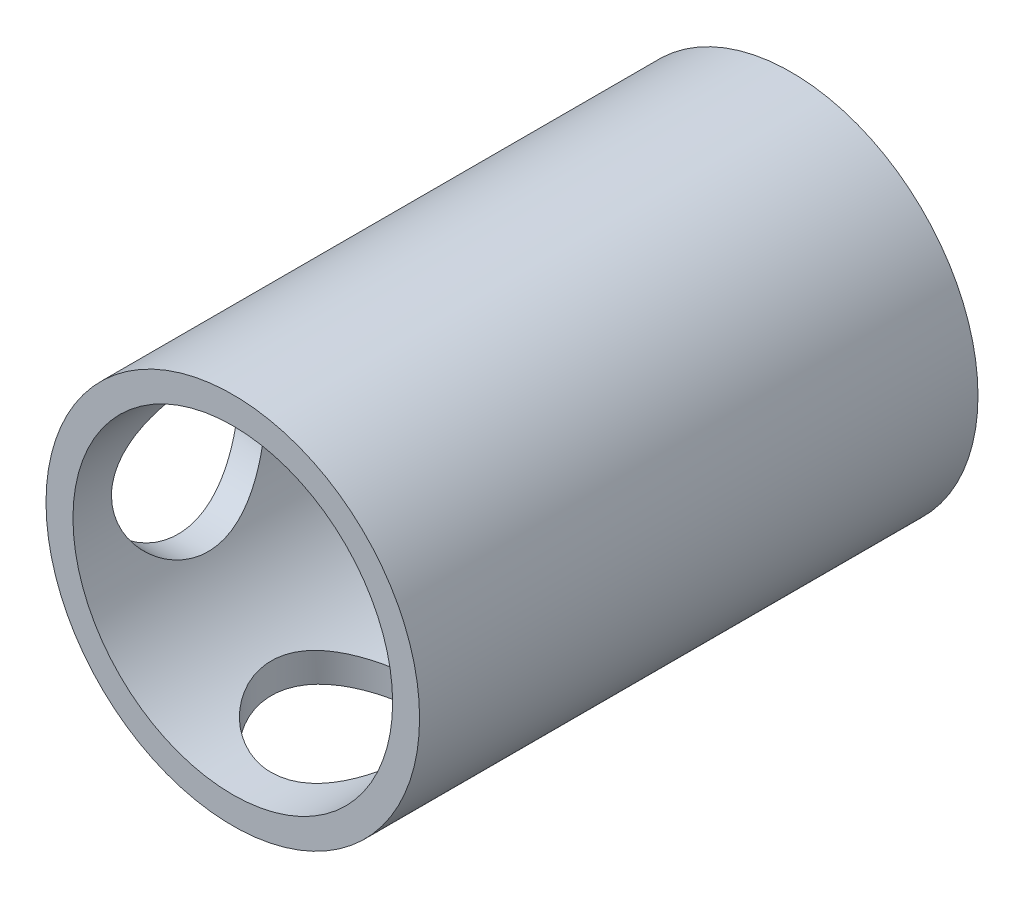
ISO-10303-21;
HEADER;
FILE_DESCRIPTION(('STEP AP214'),'2;1');
FILE_NAME('part.step','',(''),(''),'','','');
FILE_SCHEMA(('AUTOMOTIVE_DESIGN { 1 0 10303 214 1 1 1 1 }'));
ENDSEC;
DATA;
#1=APPLICATION_CONTEXT('core data for automotive mechanical design processes');
#2=APPLICATION_PROTOCOL_DEFINITION('international standard','automotive_design',2000,#1);
#3=PRODUCT_CONTEXT('',#1,'mechanical');
#4=PRODUCT('Part','Part','',(#3));
#5=PRODUCT_RELATED_PRODUCT_CATEGORY('part','',(#4));
#6=PRODUCT_DEFINITION_FORMATION('','',#4);
#7=PRODUCT_DEFINITION_CONTEXT('part definition',#1,'design');
#8=PRODUCT_DEFINITION('design','',#6,#7);
#9=PRODUCT_DEFINITION_SHAPE('','',#8);
#10=(LENGTH_UNIT() NAMED_UNIT(*) SI_UNIT(.MILLI.,.METRE.));
#11=(NAMED_UNIT(*) PLANE_ANGLE_UNIT() SI_UNIT($,.RADIAN.));
#12=(NAMED_UNIT(*) SI_UNIT($,.STERADIAN.) SOLID_ANGLE_UNIT());
#13=UNCERTAINTY_MEASURE_WITH_UNIT(LENGTH_MEASURE(1.E-05),#10,'distance_accuracy_value','');
#14=(GEOMETRIC_REPRESENTATION_CONTEXT(3) GLOBAL_UNCERTAINTY_ASSIGNED_CONTEXT((#13)) GLOBAL_UNIT_ASSIGNED_CONTEXT((#10,
#11,#12)) REPRESENTATION_CONTEXT('',''));
#15=CARTESIAN_POINT('',(0.,0.,0.));
#16=DIRECTION('',(0.,0.,1.));
#17=DIRECTION('',(1.,0.,0.));
#18=AXIS2_PLACEMENT_3D('',#15,#16,#17);
#19=CARTESIAN_POINT('',(0.,0.,30.217871555019));
#20=DIRECTION('',(0.,0.,-1.));
#21=DIRECTION('',(-1.,0.,0.));
#22=AXIS2_PLACEMENT_3D('',#19,#20,#21);
#23=CYLINDRICAL_SURFACE('',#22,4.85);
#24=CARTESIAN_POINT('',(0.,-4.85,15.5));
#25=CARTESIAN_POINT('',(0.107226656132272,-4.84999164392602,15.4999888393246));
#26=CARTESIAN_POINT('',(0.214626662999602,-4.84640269906405,15.4913255865507));
#27=CARTESIAN_POINT('',(0.426387050139813,-4.83239380402341,15.4569780586482));
#28=CARTESIAN_POINT('',(0.530738649298609,-4.82195582996195,15.4312488709154));
#29=CARTESIAN_POINT('',(0.73299338650563,-4.79537131847268,15.3638771494179));
#30=CARTESIAN_POINT('',(0.830916901193292,-4.77924396698591,15.3222880613194));
#31=CARTESIAN_POINT('',(1.01830388251928,-4.74285572187185,15.2245954280438));
#32=CARTESIAN_POINT('',(1.10776999671996,-4.72259612814289,15.1684964458263));
#33=CARTESIAN_POINT('',(1.28026169229925,-4.67885696703444,15.040448403029));
#34=CARTESIAN_POINT('',(1.36281459106649,-4.65527336407206,14.9678984316647));
#35=CARTESIAN_POINT('',(1.51498615599734,-4.60800158990991,14.8102777449425));
#36=CARTESIAN_POINT('',(1.58459814039323,-4.5843133711202,14.7252006018454));
#37=CARTESIAN_POINT('',(1.71220799668629,-4.53824549046618,14.5399917545099));
#38=CARTESIAN_POINT('',(1.7694887037098,-4.51598308022741,14.4393337121748));
#39=CARTESIAN_POINT('',(1.86609470319565,-4.47693264690528,14.2287590034344));
#40=CARTESIAN_POINT('',(1.90542905767595,-4.46014186214919,14.1188470430857));
#41=CARTESIAN_POINT('',(1.9630842761893,-4.43505941824576,13.8983233642835));
#42=CARTESIAN_POINT('',(1.98231370450878,-4.42640226587084,13.7879923393116));
#43=CARTESIAN_POINT('',(2.00204883865987,-4.41751401093733,13.56535612952));
#44=CARTESIAN_POINT('',(2.0025645699972,-4.41727839670155,13.453052034001));
#45=CARTESIAN_POINT('',(1.9855430927153,-4.42494986744056,13.2386220076985));
#46=CARTESIAN_POINT('',(1.96935324141011,-4.43224924958071,13.1363630529787));
#47=CARTESIAN_POINT('',(1.92163666851904,-4.45314311920242,12.9361686066197));
#48=CARTESIAN_POINT('',(1.89010707983337,-4.46673878347848,12.8382339269505));
#49=CARTESIAN_POINT('',(1.81199462569928,-4.49899840032512,12.6470225864048));
#50=CARTESIAN_POINT('',(1.76510864346071,-4.51776308689183,12.5538875102381));
#51=CARTESIAN_POINT('',(1.65782821279438,-4.55822188849605,12.3764498880343));
#52=CARTESIAN_POINT('',(1.59742850019962,-4.57991714380489,12.2921508028306));
#53=CARTESIAN_POINT('',(1.45897522763857,-4.62597380063074,12.1274483507342));
#54=CARTESIAN_POINT('',(1.37987542987473,-4.65040738961828,12.0479422076572));
#55=CARTESIAN_POINT('',(1.20921814207707,-4.69767233155997,11.9030260646478));
#56=CARTESIAN_POINT('',(1.11765785898047,-4.72050332354204,11.8376192336452));
#57=CARTESIAN_POINT('',(0.921999719282,-4.76262912918937,11.7214793133461));
#58=CARTESIAN_POINT('',(0.817668762672724,-4.78183424649187,11.6711039889638));
#59=CARTESIAN_POINT('',(0.601019375844602,-4.8138587456966,11.5889329116519));
#60=CARTESIAN_POINT('',(0.48870530375565,-4.82668158166672,11.557127107348));
#61=CARTESIAN_POINT('',(0.266781865416234,-4.84385560161592,11.5148592352241));
#62=CARTESIAN_POINT('',(0.157438788100635,-4.84868411068966,11.5031926440203));
#63=CARTESIAN_POINT('',(-0.0617399591240226,-4.85084380260793,11.4979523025008));
#64=CARTESIAN_POINT('',(-0.171575482689633,-4.84817708222789,11.5043734921657));
#65=CARTESIAN_POINT('',(-0.383028186720643,-4.83595635772591,11.5342578303902));
#66=CARTESIAN_POINT('',(-0.484785866122626,-4.82674186383269,11.5568813069847));
#67=CARTESIAN_POINT('',(-0.682954760649825,-4.8027120060117,11.6173662402538));
#68=CARTESIAN_POINT('',(-0.779365295278352,-4.7878959310737,11.6552296313743));
#69=CARTESIAN_POINT('',(-0.967470241007495,-4.75351772428152,11.7463573880752));
#70=CARTESIAN_POINT('',(-1.05892614547144,-4.73382282598544,11.800062377416));
#71=CARTESIAN_POINT('',(-1.23185391690123,-4.6917979342948,11.9208635591117));
#72=CARTESIAN_POINT('',(-1.31332163216142,-4.66946685265952,11.9879652897211));
#73=CARTESIAN_POINT('',(-1.46995640979388,-4.62264777856471,12.1391585804153));
#74=CARTESIAN_POINT('',(-1.54428222101207,-4.59811828020492,12.2241110645841));
#75=CARTESIAN_POINT('',(-1.67785027405913,-4.55108180477493,12.4056859515293));
#76=CARTESIAN_POINT('',(-1.73708934772316,-4.52857525315788,12.5023107991927));
#77=CARTESIAN_POINT('',(-1.83936921227792,-4.48801750942252,12.7063360505435));
#78=CARTESIAN_POINT('',(-1.88218941028024,-4.47002804166725,12.8138602086341));
#79=CARTESIAN_POINT('',(-1.9487606906181,-4.44141523557575,13.035565429731));
#80=CARTESIAN_POINT('',(-1.97252706189911,-4.4307859922709,13.1497410764521));
#81=CARTESIAN_POINT('',(-1.99881164359682,-4.41898635943142,13.3721944839154));
#82=CARTESIAN_POINT('',(-2.00280219254948,-4.41716082510923,13.480264402729));
#83=CARTESIAN_POINT('',(-1.99333578968747,-4.4214409436518,13.695466153408));
#84=CARTESIAN_POINT('',(-1.97988138728372,-4.42754543761987,13.8025981200427));
#85=CARTESIAN_POINT('',(-1.93713511331695,-4.44640432999696,14.0079594520337));
#86=CARTESIAN_POINT('',(-1.90857749526495,-4.45884951870764,14.1063727265986));
#87=CARTESIAN_POINT('',(-1.83714507107815,-4.48875141419267,14.2970382822545));
#88=CARTESIAN_POINT('',(-1.79426625920431,-4.50620952292428,14.3892888309147));
#89=CARTESIAN_POINT('',(-1.69247187194668,-4.54545695398633,14.5709901041128));
#90=CARTESIAN_POINT('',(-1.63275480176122,-4.56744199376871,14.6599487707372));
#91=CARTESIAN_POINT('',(-1.50011414028868,-4.61270681705995,14.8270438301445));
#92=CARTESIAN_POINT('',(-1.42718612239294,-4.63598703272786,14.9051765799399));
#93=CARTESIAN_POINT('',(-1.26406665868675,-4.68319697512573,15.0540825606968));
#94=CARTESIAN_POINT('',(-1.17301911372174,-4.70705621652698,15.1239446504155));
#95=CARTESIAN_POINT('',(-0.979602393317271,-4.75107365337677,15.2474379502719));
#96=CARTESIAN_POINT('',(-0.87722806785083,-4.77123015410172,15.301061735474));
#97=CARTESIAN_POINT('',(-0.665735292548961,-4.80526541223549,15.3893674729411));
#98=CARTESIAN_POINT('',(-0.556762500362008,-4.81924584198584,15.4243583144117));
#99=CARTESIAN_POINT('',(-0.333981984769177,-4.83976936645657,15.4752025162964));
#100=CARTESIAN_POINT('',(-0.220190631019941,-4.84633582769736,15.4911160124145));
#101=CARTESIAN_POINT('',(-0.0706958361550112,-4.84961618944312,15.4990666090106));
#102=CARTESIAN_POINT('',(-0.0353573423838457,-4.85000275536494,15.5000036801653));
#103=CARTESIAN_POINT('',(0.,-4.85,15.5));
#104=B_SPLINE_CURVE_WITH_KNOTS('',3,(#24,#25,#26,#27,#28,#29,#30,#31,#32,#33,#34,#35,#36,#37,
#38,#39,#40,#41,#42,#43,#44,#45,#46,#47,#48,#49,#50,#51,#52,#53,#54,#55,#56,#57,#58,#59,#60,#61,
#62,#63,#64,#65,#66,#67,#68,#69,#70,#71,#72,#73,#74,#75,#76,#77,#78,#79,#80,#81,#82,#83,#84,#85,
#86,#87,#88,#89,#90,#91,#92,#93,#94,#95,#96,#97,#98,#99,#100,#101,#102,#103),.UNSPECIFIED.,.T.,
.F.,(4,2,2,2,2,2,2,2,2,2,2,2,2,2,2,2,2,2,2,2,2,2,2,2,2,2,2,2,2,2,2,2,2,2,2,2,2,2,2,4),(0.,
0.321580903286163,0.644011490267525,0.965364997404446,1.286617570379,1.62236393870542,
1.95828318399111,2.31031372644919,2.66216631367487,2.99732277155025,3.33229967310268,
3.64222248376837,3.95220324335258,4.2687139796496,4.58534822553474,4.92814152422267,
5.27101178821648,5.62148933906687,5.97177700591223,6.30027688983169,6.62868488571295,
6.94120166922482,7.25375813390278,7.57599379977958,7.89836295575276,8.24331640289229,
8.58834222949175,8.93785346592272,9.2870839702123,9.6098768208529,9.93262250375682,
10.2409521460092,10.5493681025653,10.8761096869405,11.2029609562152,11.552925537195,
11.9030498980648,12.2471735416488,12.5902095604391,12.6962489214686),.UNSPECIFIED.);
#105=CARTESIAN_POINT('',(0.,-4.85,15.5));
#106=VERTEX_POINT('',#105);
#107=EDGE_CURVE('E68',#106,#106,#104,.T.);
#108=ORIENTED_EDGE('',*,*,#107,.T.);
#109=EDGE_LOOP('',(#108));
#110=FACE_BOUND('',#109,.T.);
#111=CARTESIAN_POINT('',(-4.85,0.,15.5));
#112=CARTESIAN_POINT('',(-4.84999164392602,-0.107226656132272,15.4999888393246));
#113=CARTESIAN_POINT('',(-4.84640269906405,-0.214626662999602,15.4913255865507));
#114=CARTESIAN_POINT('',(-4.83239380402341,-0.426387050139813,15.4569780586482));
#115=CARTESIAN_POINT('',(-4.82195582996195,-0.53073864929861,15.4312488709154));
#116=CARTESIAN_POINT('',(-4.79537131847268,-0.73299338650563,15.3638771494179));
#117=CARTESIAN_POINT('',(-4.77924396698591,-0.830916901193292,15.3222880613194));
#118=CARTESIAN_POINT('',(-4.74285572187185,-1.01830388251928,15.2245954280438));
#119=CARTESIAN_POINT('',(-4.72259612814289,-1.10776999671996,15.1684964458263));
#120=CARTESIAN_POINT('',(-4.67885696703444,-1.28026169229925,15.040448403029));
#121=CARTESIAN_POINT('',(-4.65527336407206,-1.36281459106649,14.9678984316647));
#122=CARTESIAN_POINT('',(-4.60800158990991,-1.51498615599734,14.8102777449425));
#123=CARTESIAN_POINT('',(-4.5843133711202,-1.58459814039323,14.7252006018454));
#124=CARTESIAN_POINT('',(-4.53824549046618,-1.71220799668629,14.5399917545099));
#125=CARTESIAN_POINT('',(-4.51598308022741,-1.7694887037098,14.4393337121748));
#126=CARTESIAN_POINT('',(-4.47693264690528,-1.86609470319566,14.2287590034344));
#127=CARTESIAN_POINT('',(-4.46014186214919,-1.90542905767596,14.1188470430857));
#128=CARTESIAN_POINT('',(-4.43505941824576,-1.96308427618931,13.8983233642835));
#129=CARTESIAN_POINT('',(-4.42640226587084,-1.98231370450878,13.7879923393116));
#130=CARTESIAN_POINT('',(-4.41751401093733,-2.00204883865987,13.56535612952));
#131=CARTESIAN_POINT('',(-4.41727839670155,-2.0025645699972,13.453052034001));
#132=CARTESIAN_POINT('',(-4.42494986744056,-1.98554309271531,13.2386220076985));
#133=CARTESIAN_POINT('',(-4.4322492495807,-1.96935324141011,13.1363630529787));
#134=CARTESIAN_POINT('',(-4.45314311920242,-1.92163666851904,12.9361686066197));
#135=CARTESIAN_POINT('',(-4.46673878347848,-1.89010707983338,12.8382339269505));
#136=CARTESIAN_POINT('',(-4.49899840032512,-1.81199462569928,12.6470225864048));
#137=CARTESIAN_POINT('',(-4.51776308689183,-1.76510864346072,12.5538875102381));
#138=CARTESIAN_POINT('',(-4.55822188849605,-1.65782821279438,12.3764498880343));
#139=CARTESIAN_POINT('',(-4.57991714380489,-1.59742850019962,12.2921508028306));
#140=CARTESIAN_POINT('',(-4.62597380063074,-1.45897522763857,12.1274483507342));
#141=CARTESIAN_POINT('',(-4.65040738961828,-1.37987542987473,12.0479422076572));
#142=CARTESIAN_POINT('',(-4.69767233155997,-1.20921814207707,11.9030260646478));
#143=CARTESIAN_POINT('',(-4.72050332354204,-1.11765785898047,11.8376192336452));
#144=CARTESIAN_POINT('',(-4.76262912918937,-0.921999719282003,11.7214793133461));
#145=CARTESIAN_POINT('',(-4.78183424649187,-0.817668762672727,11.6711039889638));
#146=CARTESIAN_POINT('',(-4.8138587456966,-0.601019375844605,11.5889329116519));
#147=CARTESIAN_POINT('',(-4.82668158166672,-0.488705303755653,11.557127107348));
#148=CARTESIAN_POINT('',(-4.84385560161592,-0.266781865416237,11.5148592352241));
#149=CARTESIAN_POINT('',(-4.84868411068966,-0.157438788100636,11.5031926440203));
#150=CARTESIAN_POINT('',(-4.85084380260793,0.0617399591240212,11.4979523025008));
#151=CARTESIAN_POINT('',(-4.84817708222789,0.171575482689632,11.5043734921657));
#152=CARTESIAN_POINT('',(-4.83595635772591,0.383028186720642,11.5342578303902));
#153=CARTESIAN_POINT('',(-4.82674186383269,0.484785866122625,11.5568813069847));
#154=CARTESIAN_POINT('',(-4.8027120060117,0.682954760649824,11.6173662402538));
#155=CARTESIAN_POINT('',(-4.7878959310737,0.779365295278351,11.6552296313743));
#156=CARTESIAN_POINT('',(-4.75351772428152,0.967470241007494,11.7463573880752));
#157=CARTESIAN_POINT('',(-4.73382282598544,1.05892614547144,11.800062377416));
#158=CARTESIAN_POINT('',(-4.6917979342948,1.23185391690123,11.9208635591117));
#159=CARTESIAN_POINT('',(-4.66946685265952,1.31332163216142,11.9879652897211));
#160=CARTESIAN_POINT('',(-4.62264777856471,1.46995640979388,12.1391585804153));
#161=CARTESIAN_POINT('',(-4.59811828020492,1.54428222101207,12.2241110645841));
#162=CARTESIAN_POINT('',(-4.55108180477493,1.67785027405913,12.4056859515293));
#163=CARTESIAN_POINT('',(-4.52857525315788,1.73708934772316,12.5023107991927));
#164=CARTESIAN_POINT('',(-4.48801750942252,1.83936921227792,12.7063360505435));
#165=CARTESIAN_POINT('',(-4.47002804166725,1.88218941028025,12.8138602086341));
#166=CARTESIAN_POINT('',(-4.44141523557575,1.9487606906181,13.035565429731));
#167=CARTESIAN_POINT('',(-4.4307859922709,1.97252706189912,13.1497410764521));
#168=CARTESIAN_POINT('',(-4.41898635943142,1.99881164359682,13.3721944839154));
#169=CARTESIAN_POINT('',(-4.41716082510923,2.00280219254948,13.480264402729));
#170=CARTESIAN_POINT('',(-4.4214409436518,1.99333578968747,13.695466153408));
#171=CARTESIAN_POINT('',(-4.42754543761987,1.97988138728372,13.8025981200427));
#172=CARTESIAN_POINT('',(-4.44640432999696,1.93713511331695,14.0079594520337));
#173=CARTESIAN_POINT('',(-4.45884951870763,1.90857749526495,14.1063727265986));
#174=CARTESIAN_POINT('',(-4.48875141419266,1.83714507107815,14.2970382822545));
#175=CARTESIAN_POINT('',(-4.50620952292428,1.79426625920431,14.3892888309147));
#176=CARTESIAN_POINT('',(-4.54545695398632,1.69247187194669,14.5709901041128));
#177=CARTESIAN_POINT('',(-4.56744199376871,1.63275480176122,14.6599487707372));
#178=CARTESIAN_POINT('',(-4.61270681705995,1.50011414028868,14.8270438301445));
#179=CARTESIAN_POINT('',(-4.63598703272786,1.42718612239294,14.9051765799399));
#180=CARTESIAN_POINT('',(-4.68319697512573,1.26406665868675,15.0540825606968));
#181=CARTESIAN_POINT('',(-4.70705621652698,1.17301911372175,15.1239446504155));
#182=CARTESIAN_POINT('',(-4.75107365337677,0.979602393317273,15.2474379502719));
#183=CARTESIAN_POINT('',(-4.77123015410172,0.877228067850832,15.301061735474));
#184=CARTESIAN_POINT('',(-4.80526541223549,0.665735292548965,15.3893674729411));
#185=CARTESIAN_POINT('',(-4.81924584198584,0.556762500362012,15.4243583144117));
#186=CARTESIAN_POINT('',(-4.83976936645657,0.333981984769181,15.4752025162964));
#187=CARTESIAN_POINT('',(-4.84633582769736,0.220190631019944,15.4911160124145));
#188=CARTESIAN_POINT('',(-4.84961618944312,0.0706958361550133,15.4990666090106));
#189=CARTESIAN_POINT('',(-4.85000275536494,0.0353573423838467,15.5000036801653));
#190=CARTESIAN_POINT('',(-4.85,0.,15.5));
#191=B_SPLINE_CURVE_WITH_KNOTS('',3,(#111,#112,#113,#114,#115,#116,#117,#118,#119,#120,#121,
#122,#123,#124,#125,#126,#127,#128,#129,#130,#131,#132,#133,#134,#135,#136,#137,#138,#139,#140,
#141,#142,#143,#144,#145,#146,#147,#148,#149,#150,#151,#152,#153,#154,#155,#156,#157,#158,#159,
#160,#161,#162,#163,#164,#165,#166,#167,#168,#169,#170,#171,#172,#173,#174,#175,#176,#177,#178,
#179,#180,#181,#182,#183,#184,#185,#186,#187,#188,#189,#190),.UNSPECIFIED.,.T.,.F.,(4,2,2,2,2,2,
2,2,2,2,2,2,2,2,2,2,2,2,2,2,2,2,2,2,2,2,2,2,2,2,2,2,2,2,2,2,2,2,2,4),(0.,0.321580903286163,
0.644011490267525,0.965364997404446,1.286617570379,1.62236393870542,1.95828318399111,
2.31031372644919,2.66216631367487,2.99732277155025,3.33229967310268,3.64222248376838,
3.95220324335258,4.2687139796496,4.58534822553474,4.92814152422268,5.27101178821648,
5.62148933906687,5.97177700591224,6.30027688983169,6.62868488571295,6.94120166922483,
7.25375813390279,7.57599379977959,7.89836295575277,8.24331640289229,8.58834222949176,
8.93785346592273,9.28708397021231,9.6098768208529,9.93262250375683,10.2409521460093,
10.5493681025653,10.8761096869405,11.2029609562152,11.552925537195,11.9030498980648,
12.2471735416489,12.5902095604391,12.6962489214686),.UNSPECIFIED.);
#192=CARTESIAN_POINT('',(-4.85,0.,15.5));
#193=VERTEX_POINT('',#192);
#194=EDGE_CURVE('E53',#193,#193,#191,.T.);
#195=ORIENTED_EDGE('',*,*,#194,.T.);
#196=EDGE_LOOP('',(#195));
#197=FACE_BOUND('',#196,.T.);
#198=CARTESIAN_POINT('',(0.,0.,1.99999999999999));
#199=DIRECTION('',(0.,0.,1.));
#200=DIRECTION('',(1.,0.,0.));
#201=AXIS2_PLACEMENT_3D('',#198,#199,#200);
#202=CIRCLE('',#201,4.85);
#203=CARTESIAN_POINT('',(4.85,0.,1.99999999999999));
#204=VERTEX_POINT('',#203);
#205=EDGE_CURVE('E44',#204,#204,#202,.T.);
#206=ORIENTED_EDGE('',*,*,#205,.T.);
#207=EDGE_LOOP('',(#206));
#208=FACE_BOUND('',#207,.T.);
#209=CARTESIAN_POINT('',(0.,0.,16.5));
#210=DIRECTION('',(0.,0.,1.));
#211=DIRECTION('',(1.,0.,0.));
#212=AXIS2_PLACEMENT_3D('',#209,#210,#211);
#213=CIRCLE('',#212,4.85);
#214=CARTESIAN_POINT('',(4.85,0.,16.5));
#215=VERTEX_POINT('',#214);
#216=EDGE_CURVE('E10',#215,#215,#213,.T.);
#217=ORIENTED_EDGE('',*,*,#216,.F.);
#218=EDGE_LOOP('',(#217));
#219=FACE_BOUND('',#218,.T.);
#220=ADVANCED_FACE('F31',(#110,#197,#208,#219),#23,.T.);
#221=CARTESIAN_POINT('',(0.,0.,1.99999999999999));
#222=DIRECTION('',(0.,0.,1.));
#223=DIRECTION('',(1.,0.,0.));
#224=AXIS2_PLACEMENT_3D('',#221,#222,#223);
#225=PLANE('',#224);
#226=ORIENTED_EDGE('',*,*,#205,.F.);
#227=EDGE_LOOP('',(#226));
#228=FACE_BOUND('',#227,.T.);
#229=CARTESIAN_POINT('',(0.,0.,1.99999999999999));
#230=DIRECTION('',(0.,0.,1.));
#231=DIRECTION('',(1.,0.,0.));
#232=AXIS2_PLACEMENT_3D('',#229,#230,#231);
#233=CIRCLE('',#232,4.15);
#234=CARTESIAN_POINT('',(4.15,0.,1.99999999999999));
#235=VERTEX_POINT('',#234);
#236=EDGE_CURVE('E49',#235,#235,#233,.T.);
#237=ORIENTED_EDGE('',*,*,#236,.T.);
#238=EDGE_LOOP('',(#237));
#239=FACE_BOUND('',#238,.T.);
#240=ADVANCED_FACE('F86',(#228,#239),#225,.F.);
#241=CARTESIAN_POINT('',(0.,0.,30.217871555019));
#242=DIRECTION('',(0.,0.,-1.));
#243=DIRECTION('',(-1.,0.,0.));
#244=AXIS2_PLACEMENT_3D('',#241,#242,#243);
#245=CYLINDRICAL_SURFACE('',#244,4.15);
#246=CARTESIAN_POINT('',(0.,-4.15,15.5));
#247=CARTESIAN_POINT('',(0.105594249167992,-4.14999468699563,15.4999937725478));
#248=CARTESIAN_POINT('',(0.211327750601197,-4.14592594649106,15.4915881504621));
#249=CARTESIAN_POINT('',(0.41969812235404,-4.13005173237486,15.4583240639878));
#250=CARTESIAN_POINT('',(0.522328102845229,-4.1182302027569,15.4334314540259));
#251=CARTESIAN_POINT('',(0.721154024983716,-4.08809372030654,15.3683776371058));
#252=CARTESIAN_POINT('',(0.817372743037878,-4.06980339098706,15.3282742885316));
#253=CARTESIAN_POINT('',(1.0015873486063,-4.0284300078665,15.2342226142426));
#254=CARTESIAN_POINT('',(1.08958427514102,-4.00534756085549,15.180276041188));
#255=CARTESIAN_POINT('',(1.26054016397205,-3.95498785398278,15.0565356344859));
#256=CARTESIAN_POINT('',(1.3429203408012,-3.92754589590356,14.9860101147449));
#257=CARTESIAN_POINT('',(1.49520975065151,-3.87213471309737,14.832680644967));
#258=CARTESIAN_POINT('',(1.56511019931596,-3.84416513217378,14.7498681207198));
#259=CARTESIAN_POINT('',(1.69539656679949,-3.78860104313918,14.5672752612668));
#260=CARTESIAN_POINT('',(1.75476043277384,-3.76117285363479,14.4667092451225));
#261=CARTESIAN_POINT('',(1.85548137203044,-3.71252463026234,14.2555433905688));
#262=CARTESIAN_POINT('',(1.89685059082019,-3.69130041220012,14.1449503810043));
#263=CARTESIAN_POINT('',(1.95783553555649,-3.65930481224296,13.9234328004486));
#264=CARTESIAN_POINT('',(1.97857077911434,-3.64799998700907,13.8128971561128));
#265=CARTESIAN_POINT('',(2.00114899652344,-3.63566876396085,13.5893845239051));
#266=CARTESIAN_POINT('',(2.0030083734686,-3.63463344198472,13.4764097412242));
#267=CARTESIAN_POINT('',(1.98860727770339,-3.64252337701113,13.2644577437247));
#268=CARTESIAN_POINT('',(1.9743019587579,-3.65037403278751,13.165298358253));
#269=CARTESIAN_POINT('',(1.93134010956585,-3.67328352727264,12.9710118615642));
#270=CARTESIAN_POINT('',(1.90267951896839,-3.68834440532054,12.8758858994518));
#271=CARTESIAN_POINT('',(1.83127264423836,-3.72432053567199,12.6896780188386));
#272=CARTESIAN_POINT('',(1.78821396877288,-3.74536391917106,12.5987418061241));
#273=CARTESIAN_POINT('',(1.68946659678657,-3.79093078584028,12.4249642145924));
#274=CARTESIAN_POINT('',(1.63377228588879,-3.81545581418707,12.342126457636));
#275=CARTESIAN_POINT('',(1.50374463316512,-3.8686866557001,12.1767202976694));
#276=CARTESIAN_POINT('',(1.42799466622448,-3.89754637786577,12.0953112950689));
#277=CARTESIAN_POINT('',(1.2637539482589,-3.95385409596974,11.945890063657));
#278=CARTESIAN_POINT('',(1.17525793918466,-3.98130150292048,11.8778833911845));
#279=CARTESIAN_POINT('',(0.983487232557413,-4.03305021453893,11.7546489142582));
#280=CARTESIAN_POINT('',(0.879760648407271,-4.05718013254444,11.7000466210264));
#281=CARTESIAN_POINT('',(0.663134078042678,-4.09815406774067,11.6094959682402));
#282=CARTESIAN_POINT('',(0.550240953552162,-4.11500347619241,11.5735338016081));
#283=CARTESIAN_POINT('',(0.328025156604411,-4.13840378171551,11.524064995095));
#284=CARTESIAN_POINT('',(0.219121462836066,-4.14566121435126,11.5090129591822));
#285=CARTESIAN_POINT('',(0.000107456312402202,-4.15144302128878,11.4969992225708));
#286=CARTESIAN_POINT('',(-0.110002323482691,-4.14997110902962,11.5000298295694));
#287=CARTESIAN_POINT('',(-0.320027056612224,-4.13888471573297,11.5231457030224));
#288=CARTESIAN_POINT('',(-0.420111675703273,-4.12985439631388,11.54200770197));
#289=CARTESIAN_POINT('',(-0.615514866044534,-4.10528237656054,11.5943828888125));
#290=CARTESIAN_POINT('',(-0.710832893058948,-4.08973993458225,11.6278977454918));
#291=CARTESIAN_POINT('',(-0.897272138292216,-4.05298727987679,11.7095884317706));
#292=CARTESIAN_POINT('',(-0.988182704335087,-4.03162151873033,11.7581726008679));
#293=CARTESIAN_POINT('',(-1.16087520505869,-3.9853323986503,11.8681720949486));
#294=CARTESIAN_POINT('',(-1.24265313401752,-3.96040748945378,11.9295930166869));
#295=CARTESIAN_POINT('',(-1.40277929951326,-3.9067230511058,12.0701109930591));
#296=CARTESIAN_POINT('',(-1.4801076993632,-3.87782220428287,12.1503185340279));
#297=CARTESIAN_POINT('',(-1.62062946622494,-3.82123157301556,12.3227408179843));
#298=CARTESIAN_POINT('',(-1.68381475221449,-3.79354248817299,12.4149623781207));
#299=CARTESIAN_POINT('',(-1.79654431403895,-3.74151605639747,12.6134597172542));
#300=CARTESIAN_POINT('',(-1.84545355126787,-3.71735360173704,12.720145887797));
#301=CARTESIAN_POINT('',(-1.92410465806962,-3.67726814842832,12.9417842367662));
#302=CARTESIAN_POINT('',(-1.95386938822386,-3.66133532721714,13.056726373592));
#303=CARTESIAN_POINT('',(-1.9907910304813,-3.64138046390049,13.2801174786122));
#304=CARTESIAN_POINT('',(-1.99979667991241,-3.63638661175691,13.3881729918037));
#305=CARTESIAN_POINT('',(-2.00019625723876,-3.63616840686243,13.6043096668101));
#306=CARTESIAN_POINT('',(-1.991596201566,-3.64094071670172,13.7123908072469));
#307=CARTESIAN_POINT('',(-1.95872411450967,-3.65871517274641,13.9161353558065));
#308=CARTESIAN_POINT('',(-1.93580609531817,-3.67100453576373,14.01208679238));
#309=CARTESIAN_POINT('',(-1.87653802814919,-3.70164982215616,14.1987114104038));
#310=CARTESIAN_POINT('',(-1.84018386159456,-3.72000760549946,14.2893829635383));
#311=CARTESIAN_POINT('',(-1.75232258116411,-3.76223177984952,14.4695770373295));
#312=CARTESIAN_POINT('',(-1.69996280168628,-3.78638502091912,14.5586147561224));
#313=CARTESIAN_POINT('',(-1.58257072454972,-3.83693273758306,14.7272053721278));
#314=CARTESIAN_POINT('',(-1.51753215501523,-3.86332831874499,14.80675354358));
#315=CARTESIAN_POINT('',(-1.3682347691093,-3.91885748851012,14.9631697149671));
#316=CARTESIAN_POINT('',(-1.28264980984296,-3.94797356623991,15.0387849370162));
#317=CARTESIAN_POINT('',(-1.09911287192776,-4.00295131925018,15.1748121942702));
#318=CARTESIAN_POINT('',(-1.0011547557175,-4.02881136661436,15.2352166395212));
#319=CARTESIAN_POINT('',(-0.79518131525958,-4.07447048220807,15.3387414912315));
#320=CARTESIAN_POINT('',(-0.687168066808191,-4.0942707978147,15.3818654553907));
#321=CARTESIAN_POINT('',(-0.464344352850688,-4.12546275083084,15.4488028320728));
#322=CARTESIAN_POINT('',(-0.34955478745578,-4.13687891927213,15.4726726004338));
#323=CARTESIAN_POINT('',(-0.194769919884821,-4.1456107015496,15.4908780018564));
#324=CARTESIAN_POINT('',(-0.155919248239342,-4.14725297716592,15.4942945683531));
#325=CARTESIAN_POINT('',(-0.0780520638462936,-4.14944862197033,15.4988567467232));
#326=CARTESIAN_POINT('',(-0.0390355469995274,-4.15000196408454,15.500002302133));
#327=CARTESIAN_POINT('',(0.,-4.15,15.5));
#328=B_SPLINE_CURVE_WITH_KNOTS('',3,(#246,#247,#248,#249,#250,#251,#252,#253,#254,#255,#256,
#257,#258,#259,#260,#261,#262,#263,#264,#265,#266,#267,#268,#269,#270,#271,#272,#273,#274,#275,
#276,#277,#278,#279,#280,#281,#282,#283,#284,#285,#286,#287,#288,#289,#290,#291,#292,#293,#294,
#295,#296,#297,#298,#299,#300,#301,#302,#303,#304,#305,#306,#307,#308,#309,#310,#311,#312,#313,
#314,#315,#316,#317,#318,#319,#320,#321,#322,#323,#324,#325,#326,#327),.UNSPECIFIED.,.T.,.F.,(4,
2,2,2,2,2,2,2,2,2,2,2,2,2,2,2,2,2,2,2,2,2,2,2,2,2,2,2,2,2,2,2,2,2,2,2,2,2,2,2,4),(0.,
0.316623759318255,0.633905325168373,0.949991930593423,1.26603853671661,1.60021948641658,
1.93463474325072,2.29269279483804,2.65050879831381,2.98763515810508,3.32446853059627,
3.62454558641926,3.92470756622074,4.23185753430797,4.53914424619359,4.88228831555103,
5.22557434770637,5.58269619593375,5.93955313818301,6.26830664148642,6.59692030399748,
6.90225672412201,7.2076279274544,7.52212825862266,7.83676599736633,8.18055648198017,
8.52454290129584,8.8820730829243,9.23917553890107,9.56299118375293,9.88669618892404,
10.1836474256363,10.4806897622937,10.7976516200827,11.1147706705621,11.4667008790527,
11.8188063491067,12.1708392905088,12.5218380759392,12.6388830329698,12.7559309000215),.UNSPECIFIED.);
#329=CARTESIAN_POINT('',(0.,-4.15,15.5));
#330=VERTEX_POINT('',#329);
#331=EDGE_CURVE('E35',#330,#330,#328,.T.);
#332=ORIENTED_EDGE('',*,*,#331,.F.);
#333=EDGE_LOOP('',(#332));
#334=FACE_BOUND('',#333,.T.);
#335=CARTESIAN_POINT('',(-4.15,0.,15.5));
#336=CARTESIAN_POINT('',(-4.14999468699563,-0.105594249167992,15.4999937725478));
#337=CARTESIAN_POINT('',(-4.14592594649106,-0.211327750601197,15.4915881504621));
#338=CARTESIAN_POINT('',(-4.13005173237486,-0.419698122354041,15.4583240639878));
#339=CARTESIAN_POINT('',(-4.1182302027569,-0.52232810284523,15.4334314540259));
#340=CARTESIAN_POINT('',(-4.08809372030654,-0.721154024983717,15.3683776371058));
#341=CARTESIAN_POINT('',(-4.06980339098706,-0.817372743037879,15.3282742885316));
#342=CARTESIAN_POINT('',(-4.0284300078665,-1.0015873486063,15.2342226142426));
#343=CARTESIAN_POINT('',(-4.00534756085549,-1.08958427514102,15.180276041188));
#344=CARTESIAN_POINT('',(-3.95498785398278,-1.26054016397205,15.0565356344859));
#345=CARTESIAN_POINT('',(-3.92754589590356,-1.3429203408012,14.9860101147449));
#346=CARTESIAN_POINT('',(-3.87213471309737,-1.49520975065151,14.832680644967));
#347=CARTESIAN_POINT('',(-3.84416513217378,-1.56511019931596,14.7498681207198));
#348=CARTESIAN_POINT('',(-3.78860104313918,-1.69539656679949,14.5672752612668));
#349=CARTESIAN_POINT('',(-3.76117285363479,-1.75476043277384,14.4667092451225));
#350=CARTESIAN_POINT('',(-3.71252463026234,-1.85548137203045,14.2555433905688));
#351=CARTESIAN_POINT('',(-3.69130041220011,-1.89685059082019,14.1449503810043));
#352=CARTESIAN_POINT('',(-3.65930481224296,-1.95783553555649,13.9234328004486));
#353=CARTESIAN_POINT('',(-3.64799998700907,-1.97857077911434,13.8128971561128));
#354=CARTESIAN_POINT('',(-3.63566876396085,-2.00114899652345,13.5893845239051));
#355=CARTESIAN_POINT('',(-3.63463344198472,-2.0030083734686,13.4764097412242));
#356=CARTESIAN_POINT('',(-3.64252337701113,-1.98860727770339,13.2644577437247));
#357=CARTESIAN_POINT('',(-3.65037403278751,-1.9743019587579,13.165298358253));
#358=CARTESIAN_POINT('',(-3.67328352727264,-1.93134010956586,12.9710118615642));
#359=CARTESIAN_POINT('',(-3.68834440532054,-1.90267951896839,12.8758858994518));
#360=CARTESIAN_POINT('',(-3.72432053567199,-1.83127264423836,12.6896780188386));
#361=CARTESIAN_POINT('',(-3.74536391917106,-1.78821396877288,12.5987418061241));
#362=CARTESIAN_POINT('',(-3.79093078584028,-1.68946659678657,12.4249642145924));
#363=CARTESIAN_POINT('',(-3.81545581418707,-1.63377228588879,12.342126457636));
#364=CARTESIAN_POINT('',(-3.8686866557001,-1.50374463316512,12.1767202976694));
#365=CARTESIAN_POINT('',(-3.89754637786577,-1.42799466622448,12.0953112950689));
#366=CARTESIAN_POINT('',(-3.95385409596974,-1.2637539482589,11.945890063657));
#367=CARTESIAN_POINT('',(-3.98130150292048,-1.17525793918466,11.8778833911845));
#368=CARTESIAN_POINT('',(-4.03305021453893,-0.983487232557414,11.7546489142582));
#369=CARTESIAN_POINT('',(-4.05718013254444,-0.879760648407272,11.7000466210264));
#370=CARTESIAN_POINT('',(-4.09815406774067,-0.663134078042679,11.6094959682402));
#371=CARTESIAN_POINT('',(-4.11500347619241,-0.550240953552163,11.5735338016081));
#372=CARTESIAN_POINT('',(-4.13840378171551,-0.328025156604411,11.524064995095));
#373=CARTESIAN_POINT('',(-4.14566121435126,-0.219121462836065,11.5090129591822));
#374=CARTESIAN_POINT('',(-4.15144302128878,-0.000107456312402134,11.4969992225708));
#375=CARTESIAN_POINT('',(-4.14997110902962,0.110002323482691,11.5000298295694));
#376=CARTESIAN_POINT('',(-4.13888471573297,0.320027056612224,11.5231457030224));
#377=CARTESIAN_POINT('',(-4.12985439631388,0.420111675703273,11.54200770197));
#378=CARTESIAN_POINT('',(-4.10528237656054,0.615514866044534,11.5943828888125));
#379=CARTESIAN_POINT('',(-4.08973993458225,0.710832893058948,11.6278977454918));
#380=CARTESIAN_POINT('',(-4.05298727987679,0.897272138292217,11.7095884317706));
#381=CARTESIAN_POINT('',(-4.03162151873033,0.988182704335087,11.7581726008679));
#382=CARTESIAN_POINT('',(-3.9853323986503,1.16087520505869,11.8681720949486));
#383=CARTESIAN_POINT('',(-3.96040748945378,1.24265313401753,11.9295930166869));
#384=CARTESIAN_POINT('',(-3.9067230511058,1.40277929951327,12.0701109930591));
#385=CARTESIAN_POINT('',(-3.87782220428287,1.48010769936321,12.1503185340279));
#386=CARTESIAN_POINT('',(-3.82123157301556,1.62062946622494,12.3227408179843));
#387=CARTESIAN_POINT('',(-3.79354248817299,1.6838147522145,12.4149623781207));
#388=CARTESIAN_POINT('',(-3.74151605639747,1.79654431403895,12.6134597172542));
#389=CARTESIAN_POINT('',(-3.71735360173704,1.84545355126787,12.720145887797));
#390=CARTESIAN_POINT('',(-3.67726814842832,1.92410465806962,12.9417842367662));
#391=CARTESIAN_POINT('',(-3.66133532721714,1.95386938822386,13.056726373592));
#392=CARTESIAN_POINT('',(-3.64138046390049,1.9907910304813,13.2801174786122));
#393=CARTESIAN_POINT('',(-3.63638661175691,1.99979667991241,13.3881729918037));
#394=CARTESIAN_POINT('',(-3.63616840686243,2.00019625723876,13.6043096668101));
#395=CARTESIAN_POINT('',(-3.64094071670172,1.991596201566,13.7123908072469));
#396=CARTESIAN_POINT('',(-3.65871517274641,1.95872411450967,13.9161353558065));
#397=CARTESIAN_POINT('',(-3.67100453576373,1.93580609531818,14.01208679238));
#398=CARTESIAN_POINT('',(-3.70164982215616,1.87653802814919,14.1987114104038));
#399=CARTESIAN_POINT('',(-3.72000760549946,1.84018386159457,14.2893829635383));
#400=CARTESIAN_POINT('',(-3.76223177984952,1.75232258116411,14.4695770373295));
#401=CARTESIAN_POINT('',(-3.78638502091912,1.69996280168629,14.5586147561224));
#402=CARTESIAN_POINT('',(-3.83693273758306,1.58257072454973,14.7272053721278));
#403=CARTESIAN_POINT('',(-3.86332831874499,1.51753215501523,14.80675354358));
#404=CARTESIAN_POINT('',(-3.91885748851012,1.36823476910931,14.9631697149671));
#405=CARTESIAN_POINT('',(-3.94797356623991,1.28264980984297,15.0387849370162));
#406=CARTESIAN_POINT('',(-4.00295131925018,1.09911287192776,15.1748121942702));
#407=CARTESIAN_POINT('',(-4.02881136661436,1.0011547557175,15.2352166395213));
#408=CARTESIAN_POINT('',(-4.07447048220807,0.795181315259581,15.3387414912315));
#409=CARTESIAN_POINT('',(-4.0942707978147,0.687168066808192,15.3818654553907));
#410=CARTESIAN_POINT('',(-4.12546275083084,0.464344352850689,15.4488028320728));
#411=CARTESIAN_POINT('',(-4.13687891927213,0.349554787455782,15.4726726004338));
#412=CARTESIAN_POINT('',(-4.1456107015496,0.194769919884822,15.4908780018564));
#413=CARTESIAN_POINT('',(-4.14725297716592,0.155919248239343,15.4942945683531));
#414=CARTESIAN_POINT('',(-4.14944862197033,0.0780520638462938,15.4988567467232));
#415=CARTESIAN_POINT('',(-4.15000196408454,0.0390355469995275,15.500002302133));
#416=CARTESIAN_POINT('',(-4.15,0.,15.5));
#417=B_SPLINE_CURVE_WITH_KNOTS('',3,(#335,#336,#337,#338,#339,#340,#341,#342,#343,#344,#345,
#346,#347,#348,#349,#350,#351,#352,#353,#354,#355,#356,#357,#358,#359,#360,#361,#362,#363,#364,
#365,#366,#367,#368,#369,#370,#371,#372,#373,#374,#375,#376,#377,#378,#379,#380,#381,#382,#383,
#384,#385,#386,#387,#388,#389,#390,#391,#392,#393,#394,#395,#396,#397,#398,#399,#400,#401,#402,
#403,#404,#405,#406,#407,#408,#409,#410,#411,#412,#413,#414,#415,#416),.UNSPECIFIED.,.T.,.F.,(4,
2,2,2,2,2,2,2,2,2,2,2,2,2,2,2,2,2,2,2,2,2,2,2,2,2,2,2,2,2,2,2,2,2,2,2,2,2,2,2,4),(0.,
0.316623759318255,0.633905325168373,0.949991930593425,1.26603853671661,1.60021948641659,
1.93463474325073,2.29269279483805,2.65050879831381,2.98763515810508,3.32446853059627,
3.62454558641926,3.92470756622074,4.23185753430798,4.53914424619359,4.88228831555103,
5.22557434770637,5.58269619593376,5.93955313818301,6.26830664148643,6.59692030399749,
6.90225672412202,7.20762792745441,7.52212825862267,7.83676599736634,8.18055648198019,
8.52454290129585,8.88207308292431,9.23917553890108,9.56299118375294,9.88669618892405,
10.1836474256363,10.4806897622937,10.7976516200827,11.1147706705621,11.4667008790527,
11.8188063491067,12.1708392905088,12.5218380759392,12.6388830329698,12.7559309000215),.UNSPECIFIED.);
#418=CARTESIAN_POINT('',(-4.15,0.,15.5));
#419=VERTEX_POINT('',#418);
#420=EDGE_CURVE('E63',#419,#419,#417,.T.);
#421=ORIENTED_EDGE('',*,*,#420,.F.);
#422=EDGE_LOOP('',(#421));
#423=FACE_BOUND('',#422,.T.);
#424=ORIENTED_EDGE('',*,*,#236,.F.);
#425=EDGE_LOOP('',(#424));
#426=FACE_BOUND('',#425,.T.);
#427=CARTESIAN_POINT('',(0.,0.,16.5));
#428=DIRECTION('',(0.,0.,1.));
#429=DIRECTION('',(1.,0.,0.));
#430=AXIS2_PLACEMENT_3D('',#427,#428,#429);
#431=CIRCLE('',#430,4.15);
#432=CARTESIAN_POINT('',(4.15,0.,16.5));
#433=VERTEX_POINT('',#432);
#434=EDGE_CURVE('E60',#433,#433,#431,.T.);
#435=ORIENTED_EDGE('',*,*,#434,.T.);
#436=EDGE_LOOP('',(#435));
#437=FACE_BOUND('',#436,.T.);
#438=ADVANCED_FACE('F69',(#334,#423,#426,#437),#245,.F.);
#439=CARTESIAN_POINT('',(0.,0.,16.5));
#440=DIRECTION('',(0.,0.,1.));
#441=DIRECTION('',(1.,0.,0.));
#442=AXIS2_PLACEMENT_3D('',#439,#440,#441);
#443=PLANE('',#442);
#444=ORIENTED_EDGE('',*,*,#434,.F.);
#445=EDGE_LOOP('',(#444));
#446=FACE_BOUND('',#445,.T.);
#447=ORIENTED_EDGE('',*,*,#216,.T.);
#448=EDGE_LOOP('',(#447));
#449=FACE_BOUND('',#448,.T.);
#450=ADVANCED_FACE('F76',(#446,#449),#443,.T.);
#451=CARTESIAN_POINT('',(-1.91400196040975,0.,13.5));
#452=DIRECTION('',(-1.,0.,0.));
#453=DIRECTION('',(0.,0.,1.));
#454=AXIS2_PLACEMENT_3D('',#451,#452,#453);
#455=CYLINDRICAL_SURFACE('',#454,2.);
#456=ORIENTED_EDGE('',*,*,#420,.T.);
#457=EDGE_LOOP('',(#456));
#458=FACE_BOUND('',#457,.T.);
#459=ORIENTED_EDGE('',*,*,#194,.F.);
#460=EDGE_LOOP('',(#459));
#461=FACE_BOUND('',#460,.T.);
#462=ADVANCED_FACE('F72',(#458,#461),#455,.F.);
#463=CARTESIAN_POINT('',(0.,-13.5,13.5));
#464=DIRECTION('',(0.,1.,0.));
#465=DIRECTION('',(0.,0.,1.));
#466=AXIS2_PLACEMENT_3D('',#463,#464,#465);
#467=CYLINDRICAL_SURFACE('',#466,2.);
#468=ORIENTED_EDGE('',*,*,#331,.T.);
#469=EDGE_LOOP('',(#468));
#470=FACE_BOUND('',#469,.T.);
#471=ORIENTED_EDGE('',*,*,#107,.F.);
#472=EDGE_LOOP('',(#471));
#473=FACE_BOUND('',#472,.T.);
#474=ADVANCED_FACE('F75',(#470,#473),#467,.F.);
#475=CLOSED_SHELL('',(#220,#240,#438,#450,#462,#474));
#476=MANIFOLD_SOLID_BREP('B2',#475);
#477=ADVANCED_BREP_SHAPE_REPRESENTATION('',(#18,#476),#14);
#478=SHAPE_DEFINITION_REPRESENTATION(#9,#477);
ENDSEC;
END-ISO-10303-21;
